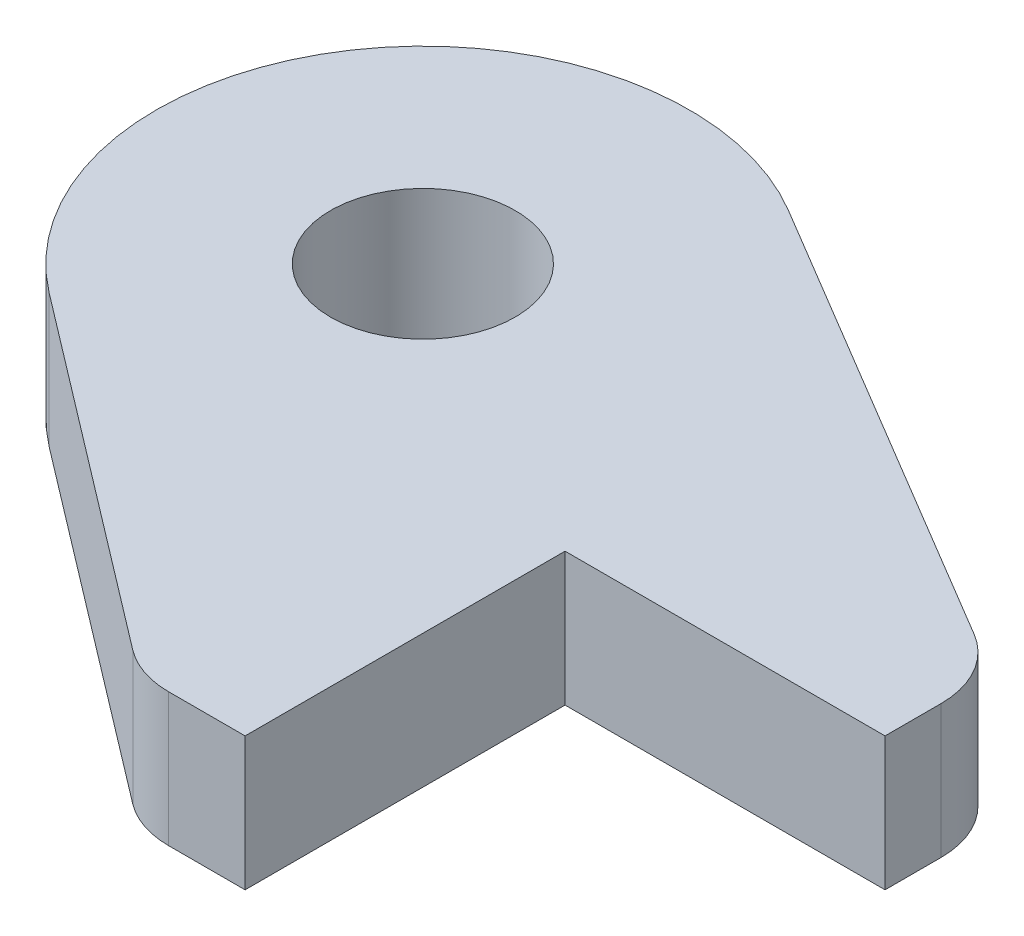
ISO-10303-21;
HEADER;
FILE_DESCRIPTION(('STEP AP214'),'2;1');
FILE_NAME('part.step','',(''),(''),'','','');
FILE_SCHEMA(('AUTOMOTIVE_DESIGN { 1 0 10303 214 1 1 1 1 }'));
ENDSEC;
DATA;
#1=APPLICATION_CONTEXT('core data for automotive mechanical design processes');
#2=APPLICATION_PROTOCOL_DEFINITION('international standard','automotive_design',2000,#1);
#3=PRODUCT_CONTEXT('',#1,'mechanical');
#4=PRODUCT('Part','Part','',(#3));
#5=PRODUCT_RELATED_PRODUCT_CATEGORY('part','',(#4));
#6=PRODUCT_DEFINITION_FORMATION('','',#4);
#7=PRODUCT_DEFINITION_CONTEXT('part definition',#1,'design');
#8=PRODUCT_DEFINITION('design','',#6,#7);
#9=PRODUCT_DEFINITION_SHAPE('','',#8);
#10=(LENGTH_UNIT() NAMED_UNIT(*) SI_UNIT(.MILLI.,.METRE.));
#11=(NAMED_UNIT(*) PLANE_ANGLE_UNIT() SI_UNIT($,.RADIAN.));
#12=(NAMED_UNIT(*) SI_UNIT($,.STERADIAN.) SOLID_ANGLE_UNIT());
#13=UNCERTAINTY_MEASURE_WITH_UNIT(LENGTH_MEASURE(1.E-05),#10,'distance_accuracy_value','');
#14=(GEOMETRIC_REPRESENTATION_CONTEXT(3) GLOBAL_UNCERTAINTY_ASSIGNED_CONTEXT((#13)) GLOBAL_UNIT_ASSIGNED_CONTEXT((#10,
#11,#12)) REPRESENTATION_CONTEXT('',''));
#15=CARTESIAN_POINT('',(0.,0.,0.));
#16=DIRECTION('',(0.,0.,1.));
#17=DIRECTION('',(1.,0.,0.));
#18=AXIS2_PLACEMENT_3D('',#15,#16,#17);
#19=CARTESIAN_POINT('',(-19.2522218567349,4.7625,-27.2312532893858));
#20=DIRECTION('',(0.512102692206308,0.,-0.858924229856774));
#21=DIRECTION('',(-0.858924229856774,0.,-0.512102692206308));
#22=AXIS2_PLACEMENT_3D('',#19,#20,#21);
#23=PLANE('',#22);
#24=DIRECTION('',(0.858924229856774,0.,0.512102692206308));
#25=VECTOR('',#24,1.);
#26=CARTESIAN_POINT('',(-19.2522218567349,4.7625,-27.2312532893858));
#27=LINE('',#26,#25);
#28=CARTESIAN_POINT('',(-19.2522218567349,4.7625,-27.2312532893858));
#29=VERTEX_POINT('',#28);
#30=CARTESIAN_POINT('',(-2.81907395224497,4.7625,-17.4335796520766));
#31=VERTEX_POINT('',#30);
#32=EDGE_CURVE('E109',#29,#31,#27,.T.);
#33=ORIENTED_EDGE('',*,*,#32,.T.);
#34=DIRECTION('',(0.,-1.,0.));
#35=VECTOR('',#34,1.);
#36=CARTESIAN_POINT('',(-2.81907395224498,4.7625,-17.4335796520766));
#37=LINE('',#36,#35);
#38=CARTESIAN_POINT('',(-2.81907395224497,0.,-17.4335796520766));
#39=VERTEX_POINT('',#38);
#40=EDGE_CURVE('E41',#31,#39,#37,.T.);
#41=ORIENTED_EDGE('',*,*,#40,.T.);
#42=DIRECTION('',(0.858924229856774,0.,0.512102692206308));
#43=VECTOR('',#42,1.);
#44=CARTESIAN_POINT('',(-19.2522218567349,0.,-27.2312532893858));
#45=LINE('',#44,#43);
#46=CARTESIAN_POINT('',(-19.2522218567349,0.,-27.2312532893858));
#47=VERTEX_POINT('',#46);
#48=EDGE_CURVE('E136',#47,#39,#45,.T.);
#49=ORIENTED_EDGE('',*,*,#48,.F.);
#50=DIRECTION('',(0.,-1.,0.));
#51=VECTOR('',#50,1.);
#52=CARTESIAN_POINT('',(-19.2522218567349,4.7625,-27.2312532893858));
#53=LINE('',#52,#51);
#54=EDGE_CURVE('E154',#29,#47,#53,.T.);
#55=ORIENTED_EDGE('',*,*,#54,.F.);
#56=EDGE_LOOP('',(#33,#41,#49,#55));
#57=FACE_BOUND('',#56,.T.);
#58=ADVANCED_FACE('F33',(#57),#23,.T.);
#59=CARTESIAN_POINT('',(-24.13,4.7625,-19.05));
#60=DIRECTION('',(0.,-1.,0.));
#61=DIRECTION('',(0.,0.,-1.));
#62=AXIS2_PLACEMENT_3D('',#59,#60,#61);
#63=CYLINDRICAL_SURFACE('',#62,9.525);
#64=CARTESIAN_POINT('',(-24.13,0.,-19.05));
#65=DIRECTION('',(0.,1.,0.));
#66=DIRECTION('',(0.,0.,1.));
#67=AXIS2_PLACEMENT_3D('',#64,#65,#66);
#68=CIRCLE('',#67,9.525);
#69=CARTESIAN_POINT('',(-29.902438630897,0.,-11.473419158187));
#70=VERTEX_POINT('',#69);
#71=EDGE_CURVE('E151',#47,#70,#68,.T.);
#72=ORIENTED_EDGE('',*,*,#71,.T.);
#73=DIRECTION('',(0.,-1.,0.));
#74=VECTOR('',#73,1.);
#75=CARTESIAN_POINT('',(-29.902438630897,4.7625,-11.473419158187));
#76=LINE('',#75,#74);
#77=CARTESIAN_POINT('',(-29.902438630897,4.7625,-11.473419158187));
#78=VERTEX_POINT('',#77);
#79=EDGE_CURVE('E157',#78,#70,#76,.T.);
#80=ORIENTED_EDGE('',*,*,#79,.F.);
#81=CARTESIAN_POINT('',(-24.13,4.7625,-19.05));
#82=DIRECTION('',(0.,1.,0.));
#83=DIRECTION('',(0.,0.,1.));
#84=AXIS2_PLACEMENT_3D('',#81,#82,#83);
#85=CIRCLE('',#84,9.525);
#86=EDGE_CURVE('E117',#29,#78,#85,.T.);
#87=ORIENTED_EDGE('',*,*,#86,.F.);
#88=ORIENTED_EDGE('',*,*,#54,.T.);
#89=EDGE_LOOP('',(#72,#80,#87,#88));
#90=FACE_BOUND('',#89,.T.);
#91=ADVANCED_FACE('F184',(#90),#63,.T.);
#92=CARTESIAN_POINT('',(-16.51,4.7625,-1.27));
#93=DIRECTION('',(-0.606030302456379,0.,0.795441558195591));
#94=DIRECTION('',(0.795441558195591,0.,0.606030302456379));
#95=AXIS2_PLACEMENT_3D('',#92,#93,#94);
#96=PLANE('',#95);
#97=DIRECTION('',(-0.795441558195591,0.,-0.606030302456379));
#98=VECTOR('',#97,1.);
#99=CARTESIAN_POINT('',(-16.51,0.,-1.27));
#100=LINE('',#99,#98);
#101=CARTESIAN_POINT('',(-17.3624620880752,0.,-1.919473052729));
#102=VERTEX_POINT('',#101);
#103=EDGE_CURVE('E149',#102,#70,#100,.T.);
#104=ORIENTED_EDGE('',*,*,#103,.F.);
#105=DIRECTION('',(0.,-1.,0.));
#106=VECTOR('',#105,1.);
#107=CARTESIAN_POINT('',(-17.3624620880752,4.7625,-1.919473052729));
#108=LINE('',#107,#106);
#109=CARTESIAN_POINT('',(-17.3624620880752,4.7625,-1.919473052729));
#110=VERTEX_POINT('',#109);
#111=EDGE_CURVE('E169',#102,#110,#108,.F.);
#112=ORIENTED_EDGE('',*,*,#111,.T.);
#113=DIRECTION('',(-0.795441558195591,0.,-0.606030302456379));
#114=VECTOR('',#113,1.);
#115=CARTESIAN_POINT('',(-16.51,4.7625,-1.27));
#116=LINE('',#115,#114);
#117=EDGE_CURVE('E132',#110,#78,#116,.T.);
#118=ORIENTED_EDGE('',*,*,#117,.T.);
#119=ORIENTED_EDGE('',*,*,#79,.T.);
#120=EDGE_LOOP('',(#104,#112,#118,#119));
#121=FACE_BOUND('',#120,.T.);
#122=ADVANCED_FACE('F211',(#121),#96,.T.);
#123=CARTESIAN_POINT('',(-12.7,4.7625,-1.27));
#124=DIRECTION('',(0.,0.,1.));
#125=DIRECTION('',(1.,0.,0.));
#126=AXIS2_PLACEMENT_3D('',#123,#124,#125);
#127=PLANE('',#126);
#128=DIRECTION('',(-1.,0.,0.));
#129=VECTOR('',#128,1.);
#130=CARTESIAN_POINT('',(-12.7,4.7625,-1.27));
#131=LINE('',#130,#129);
#132=CARTESIAN_POINT('',(-12.7,4.7625,-1.27));
#133=VERTEX_POINT('',#132);
#134=CARTESIAN_POINT('',(-15.4383158777762,4.7625,-1.27));
#135=VERTEX_POINT('',#134);
#136=EDGE_CURVE('E126',#133,#135,#131,.T.);
#137=ORIENTED_EDGE('',*,*,#136,.T.);
#138=DIRECTION('',(0.,-1.,0.));
#139=VECTOR('',#138,1.);
#140=CARTESIAN_POINT('',(-15.4383158777762,4.7625,-1.27));
#141=LINE('',#140,#139);
#142=CARTESIAN_POINT('',(-15.4383158777762,0.,-1.27));
#143=VERTEX_POINT('',#142);
#144=EDGE_CURVE('E156',#135,#143,#141,.T.);
#145=ORIENTED_EDGE('',*,*,#144,.T.);
#146=DIRECTION('',(-1.,0.,0.));
#147=VECTOR('',#146,1.);
#148=CARTESIAN_POINT('',(-12.7,0.,-1.27));
#149=LINE('',#148,#147);
#150=CARTESIAN_POINT('',(-12.7,0.,-1.27));
#151=VERTEX_POINT('',#150);
#152=EDGE_CURVE('E146',#151,#143,#149,.T.);
#153=ORIENTED_EDGE('',*,*,#152,.F.);
#154=DIRECTION('',(0.,-1.,0.));
#155=VECTOR('',#154,1.);
#156=CARTESIAN_POINT('',(-12.7,4.7625,-1.27));
#157=LINE('',#156,#155);
#158=EDGE_CURVE('E160',#133,#151,#157,.T.);
#159=ORIENTED_EDGE('',*,*,#158,.F.);
#160=EDGE_LOOP('',(#137,#145,#153,#159));
#161=FACE_BOUND('',#160,.T.);
#162=ADVANCED_FACE('F223',(#161),#127,.T.);
#163=CARTESIAN_POINT('',(-12.7,4.7625,-12.7));
#164=DIRECTION('',(1.,0.,0.));
#165=DIRECTION('',(0.,0.,-1.));
#166=AXIS2_PLACEMENT_3D('',#163,#164,#165);
#167=PLANE('',#166);
#168=DIRECTION('',(0.,0.,1.));
#169=VECTOR('',#168,1.);
#170=CARTESIAN_POINT('',(-12.7,0.,-12.7));
#171=LINE('',#170,#169);
#172=CARTESIAN_POINT('',(-12.7,0.,-12.7));
#173=VERTEX_POINT('',#172);
#174=EDGE_CURVE('E143',#173,#151,#171,.T.);
#175=ORIENTED_EDGE('',*,*,#174,.F.);
#176=DIRECTION('',(0.,-1.,0.));
#177=VECTOR('',#176,1.);
#178=CARTESIAN_POINT('',(-12.7,4.7625,-12.7));
#179=LINE('',#178,#177);
#180=CARTESIAN_POINT('',(-12.7,4.7625,-12.7));
#181=VERTEX_POINT('',#180);
#182=EDGE_CURVE('E116',#181,#173,#179,.T.);
#183=ORIENTED_EDGE('',*,*,#182,.F.);
#184=DIRECTION('',(0.,0.,1.));
#185=VECTOR('',#184,1.);
#186=CARTESIAN_POINT('',(-12.7,4.7625,-12.7));
#187=LINE('',#186,#185);
#188=EDGE_CURVE('E124',#181,#133,#187,.T.);
#189=ORIENTED_EDGE('',*,*,#188,.T.);
#190=ORIENTED_EDGE('',*,*,#158,.T.);
#191=EDGE_LOOP('',(#175,#183,#189,#190));
#192=FACE_BOUND('',#191,.T.);
#193=ADVANCED_FACE('F227',(#192),#167,.T.);
#194=CARTESIAN_POINT('',(-1.27,4.7625,-12.7));
#195=DIRECTION('',(0.,0.,1.));
#196=DIRECTION('',(1.,0.,0.));
#197=AXIS2_PLACEMENT_3D('',#194,#195,#196);
#198=PLANE('',#197);
#199=DIRECTION('',(-1.,0.,0.));
#200=VECTOR('',#199,1.);
#201=CARTESIAN_POINT('',(-1.27,0.,-12.7));
#202=LINE('',#201,#200);
#203=CARTESIAN_POINT('',(-1.27,0.,-12.7));
#204=VERTEX_POINT('',#203);
#205=EDGE_CURVE('E115',#204,#173,#202,.T.);
#206=ORIENTED_EDGE('',*,*,#205,.F.);
#207=DIRECTION('',(0.,-1.,0.));
#208=VECTOR('',#207,1.);
#209=CARTESIAN_POINT('',(-1.27,4.7625,-12.7));
#210=LINE('',#209,#208);
#211=CARTESIAN_POINT('',(-1.27,4.7625,-12.7));
#212=VERTEX_POINT('',#211);
#213=EDGE_CURVE('E105',#212,#204,#210,.T.);
#214=ORIENTED_EDGE('',*,*,#213,.F.);
#215=DIRECTION('',(-1.,0.,0.));
#216=VECTOR('',#215,1.);
#217=CARTESIAN_POINT('',(-1.27,4.7625,-12.7));
#218=LINE('',#217,#216);
#219=EDGE_CURVE('E108',#212,#181,#218,.T.);
#220=ORIENTED_EDGE('',*,*,#219,.T.);
#221=ORIENTED_EDGE('',*,*,#182,.T.);
#222=EDGE_LOOP('',(#206,#214,#220,#221));
#223=FACE_BOUND('',#222,.T.);
#224=ADVANCED_FACE('F113',(#223),#198,.T.);
#225=CARTESIAN_POINT('',(-1.27,4.7625,-16.51));
#226=DIRECTION('',(1.,0.,0.));
#227=DIRECTION('',(0.,0.,-1.));
#228=AXIS2_PLACEMENT_3D('',#225,#226,#227);
#229=PLANE('',#228);
#230=DIRECTION('',(0.,0.,1.));
#231=VECTOR('',#230,1.);
#232=CARTESIAN_POINT('',(-1.27,0.,-16.51));
#233=LINE('',#232,#231);
#234=CARTESIAN_POINT('',(-1.27,0.,-14.7064952222814));
#235=VERTEX_POINT('',#234);
#236=EDGE_CURVE('E139',#235,#204,#233,.T.);
#237=ORIENTED_EDGE('',*,*,#236,.F.);
#238=DIRECTION('',(0.,-1.,0.));
#239=VECTOR('',#238,1.);
#240=CARTESIAN_POINT('',(-1.27,4.7625,-14.7064952222814));
#241=LINE('',#240,#239);
#242=CARTESIAN_POINT('',(-1.27,4.7625,-14.7064952222814));
#243=VERTEX_POINT('',#242);
#244=EDGE_CURVE('E11',#235,#243,#241,.F.);
#245=ORIENTED_EDGE('',*,*,#244,.T.);
#246=DIRECTION('',(0.,0.,1.));
#247=VECTOR('',#246,1.);
#248=CARTESIAN_POINT('',(-1.27,4.7625,-16.51));
#249=LINE('',#248,#247);
#250=EDGE_CURVE('E102',#243,#212,#249,.T.);
#251=ORIENTED_EDGE('',*,*,#250,.T.);
#252=ORIENTED_EDGE('',*,*,#213,.T.);
#253=EDGE_LOOP('',(#237,#245,#251,#252));
#254=FACE_BOUND('',#253,.T.);
#255=ADVANCED_FACE('F104',(#254),#229,.T.);
#256=CARTESIAN_POINT('',(-24.13,4.7625,-19.05));
#257=DIRECTION('',(0.,1.,0.));
#258=DIRECTION('',(0.,0.,1.));
#259=AXIS2_PLACEMENT_3D('',#256,#257,#258);
#260=PLANE('',#259);
#261=CARTESIAN_POINT('',(-24.13,4.7625,-19.05));
#262=DIRECTION('',(0.,1.,0.));
#263=DIRECTION('',(0.,0.,1.));
#264=AXIS2_PLACEMENT_3D('',#261,#262,#263);
#265=CIRCLE('',#264,3.29999999999999);
#266=CARTESIAN_POINT('',(-24.13,4.7625,-15.75));
#267=VERTEX_POINT('',#266);
#268=EDGE_CURVE('E189',#267,#267,#265,.T.);
#269=ORIENTED_EDGE('',*,*,#268,.F.);
#270=EDGE_LOOP('',(#269));
#271=FACE_BOUND('',#270,.T.);
#272=ORIENTED_EDGE('',*,*,#117,.F.);
#273=CARTESIAN_POINT('',(-15.4383158777762,4.7625,-4.445));
#274=DIRECTION('',(0.,1.,0.));
#275=DIRECTION('',(0.,0.,1.));
#276=AXIS2_PLACEMENT_3D('',#273,#274,#275);
#277=CIRCLE('',#276,3.175);
#278=EDGE_CURVE('E172',#110,#135,#277,.T.);
#279=ORIENTED_EDGE('',*,*,#278,.T.);
#280=ORIENTED_EDGE('',*,*,#136,.F.);
#281=ORIENTED_EDGE('',*,*,#188,.F.);
#282=ORIENTED_EDGE('',*,*,#219,.F.);
#283=ORIENTED_EDGE('',*,*,#250,.F.);
#284=CARTESIAN_POINT('',(-4.445,4.7625,-14.7064952222814));
#285=DIRECTION('',(0.,1.,0.));
#286=DIRECTION('',(0.,0.,1.));
#287=AXIS2_PLACEMENT_3D('',#284,#285,#286);
#288=CIRCLE('',#287,3.175);
#289=EDGE_CURVE('E53',#243,#31,#288,.T.);
#290=ORIENTED_EDGE('',*,*,#289,.T.);
#291=ORIENTED_EDGE('',*,*,#32,.F.);
#292=ORIENTED_EDGE('',*,*,#86,.T.);
#293=EDGE_LOOP('',(#272,#279,#280,#281,#282,#283,#290,#291,#292));
#294=FACE_BOUND('',#293,.T.);
#295=ADVANCED_FACE('F121',(#271,#294),#260,.T.);
#296=CARTESIAN_POINT('',(-24.13,0.,-19.05));
#297=DIRECTION('',(0.,1.,0.));
#298=DIRECTION('',(0.,0.,1.));
#299=AXIS2_PLACEMENT_3D('',#296,#297,#298);
#300=PLANE('',#299);
#301=CARTESIAN_POINT('',(-24.13,0.,-19.05));
#302=DIRECTION('',(0.,1.,0.));
#303=DIRECTION('',(0.,0.,1.));
#304=AXIS2_PLACEMENT_3D('',#301,#302,#303);
#305=CIRCLE('',#304,3.3);
#306=CARTESIAN_POINT('',(-24.13,0.,-15.75));
#307=VERTEX_POINT('',#306);
#308=EDGE_CURVE('E140',#307,#307,#305,.T.);
#309=ORIENTED_EDGE('',*,*,#308,.T.);
#310=EDGE_LOOP('',(#309));
#311=FACE_BOUND('',#310,.T.);
#312=ORIENTED_EDGE('',*,*,#152,.T.);
#313=CARTESIAN_POINT('',(-15.4383158777762,0.,-4.445));
#314=DIRECTION('',(0.,1.,0.));
#315=DIRECTION('',(0.,0.,1.));
#316=AXIS2_PLACEMENT_3D('',#313,#314,#315);
#317=CIRCLE('',#316,3.175);
#318=EDGE_CURVE('E167',#143,#102,#317,.F.);
#319=ORIENTED_EDGE('',*,*,#318,.T.);
#320=ORIENTED_EDGE('',*,*,#103,.T.);
#321=ORIENTED_EDGE('',*,*,#71,.F.);
#322=ORIENTED_EDGE('',*,*,#48,.T.);
#323=CARTESIAN_POINT('',(-4.445,0.,-14.7064952222814));
#324=DIRECTION('',(0.,1.,0.));
#325=DIRECTION('',(0.,0.,1.));
#326=AXIS2_PLACEMENT_3D('',#323,#324,#325);
#327=CIRCLE('',#326,3.175);
#328=EDGE_CURVE('E165',#39,#235,#327,.F.);
#329=ORIENTED_EDGE('',*,*,#328,.T.);
#330=ORIENTED_EDGE('',*,*,#236,.T.);
#331=ORIENTED_EDGE('',*,*,#205,.T.);
#332=ORIENTED_EDGE('',*,*,#174,.T.);
#333=EDGE_LOOP('',(#312,#319,#320,#321,#322,#329,#330,#331,#332));
#334=FACE_BOUND('',#333,.T.);
#335=ADVANCED_FACE('F180',(#311,#334),#300,.F.);
#336=CARTESIAN_POINT('',(-15.4383158777762,4.7625,-4.445));
#337=DIRECTION('',(0.,-1.,0.));
#338=DIRECTION('',(0.,0.,-1.));
#339=AXIS2_PLACEMENT_3D('',#336,#337,#338);
#340=CYLINDRICAL_SURFACE('',#339,3.175);
#341=ORIENTED_EDGE('',*,*,#278,.F.);
#342=ORIENTED_EDGE('',*,*,#111,.F.);
#343=ORIENTED_EDGE('',*,*,#318,.F.);
#344=ORIENTED_EDGE('',*,*,#144,.F.);
#345=EDGE_LOOP('',(#341,#342,#343,#344));
#346=FACE_BOUND('',#345,.T.);
#347=ADVANCED_FACE('F201',(#346),#340,.T.);
#348=CARTESIAN_POINT('',(-4.445,4.7625,-14.7064952222814));
#349=DIRECTION('',(0.,-1.,0.));
#350=DIRECTION('',(0.,0.,-1.));
#351=AXIS2_PLACEMENT_3D('',#348,#349,#350);
#352=CYLINDRICAL_SURFACE('',#351,3.175);
#353=ORIENTED_EDGE('',*,*,#289,.F.);
#354=ORIENTED_EDGE('',*,*,#244,.F.);
#355=ORIENTED_EDGE('',*,*,#328,.F.);
#356=ORIENTED_EDGE('',*,*,#40,.F.);
#357=EDGE_LOOP('',(#353,#354,#355,#356));
#358=FACE_BOUND('',#357,.T.);
#359=ADVANCED_FACE('F35',(#358),#352,.T.);
#360=CARTESIAN_POINT('',(-24.13,4.7625,-19.05));
#361=DIRECTION('',(0.,1.,0.));
#362=DIRECTION('',(0.,0.,1.));
#363=AXIS2_PLACEMENT_3D('',#360,#361,#362);
#364=CYLINDRICAL_SURFACE('',#363,3.29999999999999);
#365=ORIENTED_EDGE('',*,*,#308,.F.);
#366=EDGE_LOOP('',(#365));
#367=FACE_BOUND('',#366,.T.);
#368=ORIENTED_EDGE('',*,*,#268,.T.);
#369=EDGE_LOOP('',(#368));
#370=FACE_BOUND('',#369,.T.);
#371=ADVANCED_FACE('F193',(#367,#370),#364,.F.);
#372=CLOSED_SHELL('',(#58,#91,#122,#162,#193,#224,#255,#295,#335,#347,#359,#371));
#373=MANIFOLD_SOLID_BREP('B2',#372);
#374=ADVANCED_BREP_SHAPE_REPRESENTATION('',(#18,#373),#14);
#375=SHAPE_DEFINITION_REPRESENTATION(#9,#374);
ENDSEC;
END-ISO-10303-21;
